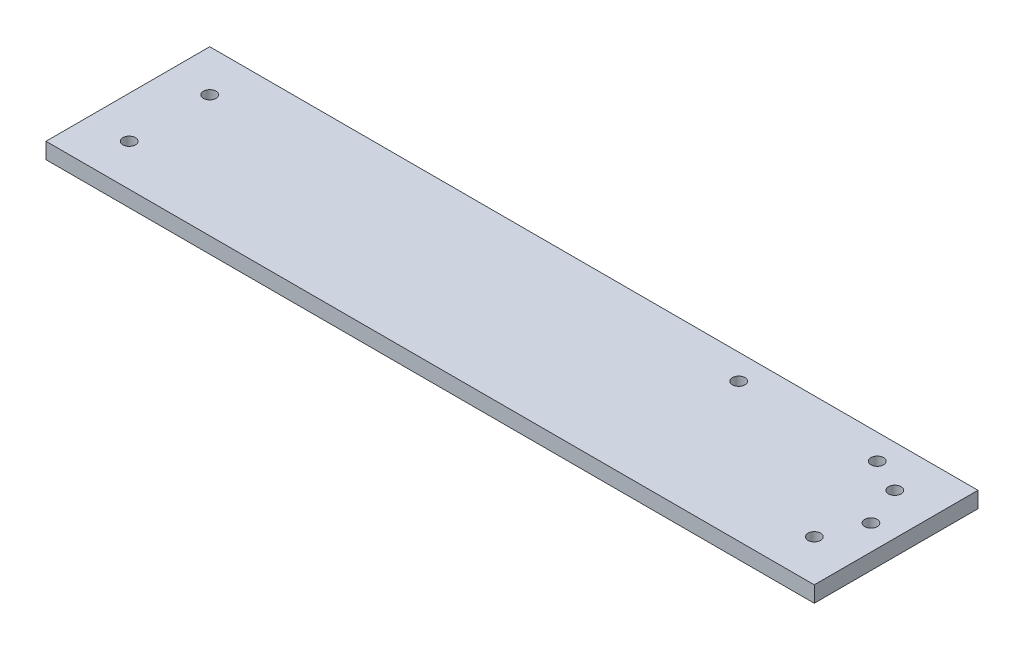
ISO-10303-21;
HEADER;
FILE_DESCRIPTION(('STEP AP214'),'2;1');
FILE_NAME('part.step','',(''),(''),'','','');
FILE_SCHEMA(('AUTOMOTIVE_DESIGN { 1 0 10303 214 1 1 1 1 }'));
ENDSEC;
DATA;
#1=APPLICATION_CONTEXT('core data for automotive mechanical design processes');
#2=APPLICATION_PROTOCOL_DEFINITION('international standard','automotive_design',2000,#1);
#3=PRODUCT_CONTEXT('',#1,'mechanical');
#4=PRODUCT('Part','Part','',(#3));
#5=PRODUCT_RELATED_PRODUCT_CATEGORY('part','',(#4));
#6=PRODUCT_DEFINITION_FORMATION('','',#4);
#7=PRODUCT_DEFINITION_CONTEXT('part definition',#1,'design');
#8=PRODUCT_DEFINITION('design','',#6,#7);
#9=PRODUCT_DEFINITION_SHAPE('','',#8);
#10=(LENGTH_UNIT() NAMED_UNIT(*) SI_UNIT(.MILLI.,.METRE.));
#11=(NAMED_UNIT(*) PLANE_ANGLE_UNIT() SI_UNIT($,.RADIAN.));
#12=(NAMED_UNIT(*) SI_UNIT($,.STERADIAN.) SOLID_ANGLE_UNIT());
#13=UNCERTAINTY_MEASURE_WITH_UNIT(LENGTH_MEASURE(1.E-05),#10,'distance_accuracy_value','');
#14=(GEOMETRIC_REPRESENTATION_CONTEXT(3) GLOBAL_UNCERTAINTY_ASSIGNED_CONTEXT((#13)) GLOBAL_UNIT_ASSIGNED_CONTEXT((#10,
#11,#12)) REPRESENTATION_CONTEXT('',''));
#15=CARTESIAN_POINT('',(0.,0.,0.));
#16=DIRECTION('',(0.,0.,1.));
#17=DIRECTION('',(1.,0.,0.));
#18=AXIS2_PLACEMENT_3D('',#15,#16,#17);
#19=CARTESIAN_POINT('',(152.5,3.175,32.5));
#20=DIRECTION('',(-1.,0.,0.));
#21=DIRECTION('',(0.,0.,1.));
#22=AXIS2_PLACEMENT_3D('',#19,#20,#21);
#23=PLANE('',#22);
#24=DIRECTION('',(0.,0.,-1.));
#25=VECTOR('',#24,1.);
#26=CARTESIAN_POINT('',(152.5,-3.175,32.5));
#27=LINE('',#26,#25);
#28=CARTESIAN_POINT('',(152.5,-3.175,32.5));
#29=VERTEX_POINT('',#28);
#30=CARTESIAN_POINT('',(152.5,-3.175,-32.5));
#31=VERTEX_POINT('',#30);
#32=EDGE_CURVE('E101',#29,#31,#27,.T.);
#33=ORIENTED_EDGE('',*,*,#32,.T.);
#34=DIRECTION('',(0.,-1.,0.));
#35=VECTOR('',#34,1.);
#36=CARTESIAN_POINT('',(152.5,3.175,-32.5));
#37=LINE('',#36,#35);
#38=CARTESIAN_POINT('',(152.5,3.175,-32.5));
#39=VERTEX_POINT('',#38);
#40=EDGE_CURVE('E11',#39,#31,#37,.T.);
#41=ORIENTED_EDGE('',*,*,#40,.F.);
#42=DIRECTION('',(0.,0.,-1.));
#43=VECTOR('',#42,1.);
#44=CARTESIAN_POINT('',(152.5,3.175,32.5));
#45=LINE('',#44,#43);
#46=CARTESIAN_POINT('',(152.5,3.175,32.5));
#47=VERTEX_POINT('',#46);
#48=EDGE_CURVE('E89',#47,#39,#45,.T.);
#49=ORIENTED_EDGE('',*,*,#48,.F.);
#50=DIRECTION('',(0.,-1.,0.));
#51=VECTOR('',#50,1.);
#52=CARTESIAN_POINT('',(152.5,3.175,32.5));
#53=LINE('',#52,#51);
#54=EDGE_CURVE('E97',#47,#29,#53,.T.);
#55=ORIENTED_EDGE('',*,*,#54,.T.);
#56=EDGE_LOOP('',(#33,#41,#49,#55));
#57=FACE_BOUND('',#56,.T.);
#58=ADVANCED_FACE('F38',(#57),#23,.F.);
#59=CARTESIAN_POINT('',(-152.5,3.175,-32.5));
#60=DIRECTION('',(0.,0.,1.));
#61=DIRECTION('',(1.,0.,0.));
#62=AXIS2_PLACEMENT_3D('',#59,#60,#61);
#63=PLANE('',#62);
#64=DIRECTION('',(-1.,0.,0.));
#65=VECTOR('',#64,1.);
#66=CARTESIAN_POINT('',(-152.5,-3.175,-32.5));
#67=LINE('',#66,#65);
#68=CARTESIAN_POINT('',(-152.5,-3.175,-32.5));
#69=VERTEX_POINT('',#68);
#70=EDGE_CURVE('E93',#31,#69,#67,.T.);
#71=ORIENTED_EDGE('',*,*,#70,.T.);
#72=DIRECTION('',(0.,-1.,0.));
#73=VECTOR('',#72,1.);
#74=CARTESIAN_POINT('',(-152.5,3.175,-32.5));
#75=LINE('',#74,#73);
#76=CARTESIAN_POINT('',(-152.5,3.175,-32.5));
#77=VERTEX_POINT('',#76);
#78=EDGE_CURVE('E46',#77,#69,#75,.T.);
#79=ORIENTED_EDGE('',*,*,#78,.F.);
#80=DIRECTION('',(-1.,0.,0.));
#81=VECTOR('',#80,1.);
#82=CARTESIAN_POINT('',(-152.5,3.175,-32.5));
#83=LINE('',#82,#81);
#84=EDGE_CURVE('E84',#39,#77,#83,.T.);
#85=ORIENTED_EDGE('',*,*,#84,.F.);
#86=ORIENTED_EDGE('',*,*,#40,.T.);
#87=EDGE_LOOP('',(#71,#79,#85,#86));
#88=FACE_BOUND('',#87,.T.);
#89=ADVANCED_FACE('F92',(#88),#63,.F.);
#90=CARTESIAN_POINT('',(-152.5,3.175,32.5));
#91=DIRECTION('',(1.,0.,0.));
#92=DIRECTION('',(0.,0.,-1.));
#93=AXIS2_PLACEMENT_3D('',#90,#91,#92);
#94=PLANE('',#93);
#95=DIRECTION('',(0.,0.,1.));
#96=VECTOR('',#95,1.);
#97=CARTESIAN_POINT('',(-152.5,-3.175,32.5));
#98=LINE('',#97,#96);
#99=CARTESIAN_POINT('',(-152.5,-3.175,32.5));
#100=VERTEX_POINT('',#99);
#101=EDGE_CURVE('E71',#69,#100,#98,.T.);
#102=ORIENTED_EDGE('',*,*,#101,.T.);
#103=DIRECTION('',(0.,-1.,0.));
#104=VECTOR('',#103,1.);
#105=CARTESIAN_POINT('',(-152.5,3.175,32.5));
#106=LINE('',#105,#104);
#107=CARTESIAN_POINT('',(-152.5,3.175,32.5));
#108=VERTEX_POINT('',#107);
#109=EDGE_CURVE('E94',#108,#100,#106,.T.);
#110=ORIENTED_EDGE('',*,*,#109,.F.);
#111=DIRECTION('',(0.,0.,1.));
#112=VECTOR('',#111,1.);
#113=CARTESIAN_POINT('',(-152.5,3.175,32.5));
#114=LINE('',#113,#112);
#115=EDGE_CURVE('E87',#77,#108,#114,.T.);
#116=ORIENTED_EDGE('',*,*,#115,.F.);
#117=ORIENTED_EDGE('',*,*,#78,.T.);
#118=EDGE_LOOP('',(#102,#110,#116,#117));
#119=FACE_BOUND('',#118,.T.);
#120=ADVANCED_FACE('F95',(#119),#94,.F.);
#121=CARTESIAN_POINT('',(-152.5,3.175,32.5));
#122=DIRECTION('',(0.,0.,-1.));
#123=DIRECTION('',(-1.,0.,0.));
#124=AXIS2_PLACEMENT_3D('',#121,#122,#123);
#125=PLANE('',#124);
#126=DIRECTION('',(1.,0.,0.));
#127=VECTOR('',#126,1.);
#128=CARTESIAN_POINT('',(-152.5,-3.175,32.5));
#129=LINE('',#128,#127);
#130=EDGE_CURVE('E77',#100,#29,#129,.T.);
#131=ORIENTED_EDGE('',*,*,#130,.T.);
#132=ORIENTED_EDGE('',*,*,#54,.F.);
#133=DIRECTION('',(1.,0.,0.));
#134=VECTOR('',#133,1.);
#135=CARTESIAN_POINT('',(-152.5,3.175,32.5));
#136=LINE('',#135,#134);
#137=EDGE_CURVE('E54',#108,#47,#136,.T.);
#138=ORIENTED_EDGE('',*,*,#137,.F.);
#139=ORIENTED_EDGE('',*,*,#109,.T.);
#140=EDGE_LOOP('',(#131,#132,#138,#139));
#141=FACE_BOUND('',#140,.T.);
#142=ADVANCED_FACE('F109',(#141),#125,.F.);
#143=CARTESIAN_POINT('',(0.,3.175,0.));
#144=DIRECTION('',(0.,-1.,0.));
#145=DIRECTION('',(0.,0.,-1.));
#146=AXIS2_PLACEMENT_3D('',#143,#144,#145);
#147=PLANE('',#146);
#148=CARTESIAN_POINT('',(142.5,3.175,0.));
#149=DIRECTION('',(0.,-1.,0.));
#150=DIRECTION('',(0.,0.,-1.));
#151=AXIS2_PLACEMENT_3D('',#148,#149,#150);
#152=CIRCLE('',#151,2.5);
#153=CARTESIAN_POINT('',(142.5,3.175,-2.5));
#154=VERTEX_POINT('',#153);
#155=EDGE_CURVE('E134',#154,#154,#152,.T.);
#156=ORIENTED_EDGE('',*,*,#155,.T.);
#157=EDGE_LOOP('',(#156));
#158=FACE_BOUND('',#157,.T.);
#159=CARTESIAN_POINT('',(67.5,3.175,-22.5));
#160=DIRECTION('',(0.,-1.,0.));
#161=DIRECTION('',(0.,0.,-1.));
#162=AXIS2_PLACEMENT_3D('',#159,#160,#161);
#163=CIRCLE('',#162,2.5);
#164=CARTESIAN_POINT('',(67.5,3.175,-25.));
#165=VERTEX_POINT('',#164);
#166=EDGE_CURVE('E141',#165,#165,#163,.T.);
#167=ORIENTED_EDGE('',*,*,#166,.T.);
#168=EDGE_LOOP('',(#167));
#169=FACE_BOUND('',#168,.T.);
#170=CARTESIAN_POINT('',(122.5,3.175,-22.5));
#171=DIRECTION('',(0.,-1.,0.));
#172=DIRECTION('',(0.,0.,-1.));
#173=AXIS2_PLACEMENT_3D('',#170,#171,#172);
#174=CIRCLE('',#173,2.49999999999999);
#175=CARTESIAN_POINT('',(122.5,3.175,-25.));
#176=VERTEX_POINT('',#175);
#177=EDGE_CURVE('E144',#176,#176,#174,.T.);
#178=ORIENTED_EDGE('',*,*,#177,.T.);
#179=EDGE_LOOP('',(#178));
#180=FACE_BOUND('',#179,.T.);
#181=CARTESIAN_POINT('',(135.98,3.175,15.98));
#182=DIRECTION('',(0.,1.,0.));
#183=DIRECTION('',(0.,0.,-1.));
#184=AXIS2_PLACEMENT_3D('',#181,#182,#183);
#185=CIRCLE('',#184,2.49999999999994);
#186=CARTESIAN_POINT('',(135.98,3.175,13.4800000000001));
#187=VERTEX_POINT('',#186);
#188=EDGE_CURVE('E122',#187,#187,#185,.T.);
#189=ORIENTED_EDGE('',*,*,#188,.F.);
#190=EDGE_LOOP('',(#189));
#191=FACE_BOUND('',#190,.T.);
#192=CARTESIAN_POINT('',(135.98,3.175,-15.98));
#193=DIRECTION('',(0.,1.,0.));
#194=DIRECTION('',(0.,0.,1.));
#195=AXIS2_PLACEMENT_3D('',#192,#193,#194);
#196=CIRCLE('',#195,2.49999999999994);
#197=CARTESIAN_POINT('',(135.98,3.175,-13.4800000000001));
#198=VERTEX_POINT('',#197);
#199=EDGE_CURVE('E127',#198,#198,#196,.T.);
#200=ORIENTED_EDGE('',*,*,#199,.F.);
#201=EDGE_LOOP('',(#200));
#202=FACE_BOUND('',#201,.T.);
#203=CARTESIAN_POINT('',(-135.98,3.175,15.98));
#204=DIRECTION('',(0.,-1.,0.));
#205=DIRECTION('',(0.,0.,-1.));
#206=AXIS2_PLACEMENT_3D('',#203,#204,#205);
#207=CIRCLE('',#206,2.49999999999994);
#208=CARTESIAN_POINT('',(-135.98,3.175,13.4800000000001));
#209=VERTEX_POINT('',#208);
#210=EDGE_CURVE('E104',#209,#209,#207,.T.);
#211=ORIENTED_EDGE('',*,*,#210,.T.);
#212=EDGE_LOOP('',(#211));
#213=FACE_BOUND('',#212,.T.);
#214=CARTESIAN_POINT('',(-135.98,3.175,-15.98));
#215=DIRECTION('',(0.,-1.,0.));
#216=DIRECTION('',(0.,0.,1.));
#217=AXIS2_PLACEMENT_3D('',#214,#215,#216);
#218=CIRCLE('',#217,2.49999999999994);
#219=CARTESIAN_POINT('',(-135.98,3.175,-13.4800000000001));
#220=VERTEX_POINT('',#219);
#221=EDGE_CURVE('E115',#220,#220,#218,.T.);
#222=ORIENTED_EDGE('',*,*,#221,.T.);
#223=EDGE_LOOP('',(#222));
#224=FACE_BOUND('',#223,.T.);
#225=ORIENTED_EDGE('',*,*,#48,.T.);
#226=ORIENTED_EDGE('',*,*,#84,.T.);
#227=ORIENTED_EDGE('',*,*,#115,.T.);
#228=ORIENTED_EDGE('',*,*,#137,.T.);
#229=EDGE_LOOP('',(#225,#226,#227,#228));
#230=FACE_BOUND('',#229,.T.);
#231=ADVANCED_FACE('F85',(#158,#169,#180,#191,#202,#213,#224,#230),#147,.F.);
#232=CARTESIAN_POINT('',(0.,-3.175,0.));
#233=DIRECTION('',(0.,-1.,0.));
#234=DIRECTION('',(0.,0.,-1.));
#235=AXIS2_PLACEMENT_3D('',#232,#233,#234);
#236=PLANE('',#235);
#237=CARTESIAN_POINT('',(142.5,-3.175,0.));
#238=DIRECTION('',(0.,1.,0.));
#239=DIRECTION('',(0.,0.,1.));
#240=AXIS2_PLACEMENT_3D('',#237,#238,#239);
#241=CIRCLE('',#240,2.5);
#242=CARTESIAN_POINT('',(142.5,-3.175,2.5));
#243=VERTEX_POINT('',#242);
#244=EDGE_CURVE('E151',#243,#243,#241,.T.);
#245=ORIENTED_EDGE('',*,*,#244,.T.);
#246=EDGE_LOOP('',(#245));
#247=FACE_BOUND('',#246,.T.);
#248=CARTESIAN_POINT('',(67.5,-3.175,-22.5));
#249=DIRECTION('',(0.,1.,0.));
#250=DIRECTION('',(0.,0.,1.));
#251=AXIS2_PLACEMENT_3D('',#248,#249,#250);
#252=CIRCLE('',#251,2.5);
#253=CARTESIAN_POINT('',(67.5,-3.175,-20.));
#254=VERTEX_POINT('',#253);
#255=EDGE_CURVE('E150',#254,#254,#252,.T.);
#256=ORIENTED_EDGE('',*,*,#255,.T.);
#257=EDGE_LOOP('',(#256));
#258=FACE_BOUND('',#257,.T.);
#259=CARTESIAN_POINT('',(122.5,-3.175,-22.5));
#260=DIRECTION('',(0.,1.,0.));
#261=DIRECTION('',(0.,0.,1.));
#262=AXIS2_PLACEMENT_3D('',#259,#260,#261);
#263=CIRCLE('',#262,2.49999999999999);
#264=CARTESIAN_POINT('',(122.5,-3.175,-20.));
#265=VERTEX_POINT('',#264);
#266=EDGE_CURVE('E147',#265,#265,#263,.T.);
#267=ORIENTED_EDGE('',*,*,#266,.T.);
#268=EDGE_LOOP('',(#267));
#269=FACE_BOUND('',#268,.T.);
#270=CARTESIAN_POINT('',(135.98,-3.175,15.98));
#271=DIRECTION('',(0.,1.,0.));
#272=DIRECTION('',(0.,0.,-1.));
#273=AXIS2_PLACEMENT_3D('',#270,#271,#272);
#274=CIRCLE('',#273,2.49999999999994);
#275=CARTESIAN_POINT('',(135.98,-3.175,13.4800000000001));
#276=VERTEX_POINT('',#275);
#277=EDGE_CURVE('E130',#276,#276,#274,.T.);
#278=ORIENTED_EDGE('',*,*,#277,.T.);
#279=EDGE_LOOP('',(#278));
#280=FACE_BOUND('',#279,.T.);
#281=CARTESIAN_POINT('',(135.98,-3.175,-15.98));
#282=DIRECTION('',(0.,1.,0.));
#283=DIRECTION('',(0.,0.,1.));
#284=AXIS2_PLACEMENT_3D('',#281,#282,#283);
#285=CIRCLE('',#284,2.49999999999994);
#286=CARTESIAN_POINT('',(135.98,-3.175,-13.4800000000001));
#287=VERTEX_POINT('',#286);
#288=EDGE_CURVE('E131',#287,#287,#285,.T.);
#289=ORIENTED_EDGE('',*,*,#288,.T.);
#290=EDGE_LOOP('',(#289));
#291=FACE_BOUND('',#290,.T.);
#292=CARTESIAN_POINT('',(-135.98,-3.175,15.98));
#293=DIRECTION('',(0.,-1.,0.));
#294=DIRECTION('',(0.,0.,-1.));
#295=AXIS2_PLACEMENT_3D('',#292,#293,#294);
#296=CIRCLE('',#295,2.49999999999994);
#297=CARTESIAN_POINT('',(-135.98,-3.175,13.4800000000001));
#298=VERTEX_POINT('',#297);
#299=EDGE_CURVE('E118',#298,#298,#296,.T.);
#300=ORIENTED_EDGE('',*,*,#299,.F.);
#301=EDGE_LOOP('',(#300));
#302=FACE_BOUND('',#301,.T.);
#303=CARTESIAN_POINT('',(-135.98,-3.175,-15.98));
#304=DIRECTION('',(0.,-1.,0.));
#305=DIRECTION('',(0.,0.,1.));
#306=AXIS2_PLACEMENT_3D('',#303,#304,#305);
#307=CIRCLE('',#306,2.49999999999994);
#308=CARTESIAN_POINT('',(-135.98,-3.175,-13.4800000000001));
#309=VERTEX_POINT('',#308);
#310=EDGE_CURVE('E119',#309,#309,#307,.T.);
#311=ORIENTED_EDGE('',*,*,#310,.F.);
#312=EDGE_LOOP('',(#311));
#313=FACE_BOUND('',#312,.T.);
#314=ORIENTED_EDGE('',*,*,#32,.F.);
#315=ORIENTED_EDGE('',*,*,#130,.F.);
#316=ORIENTED_EDGE('',*,*,#101,.F.);
#317=ORIENTED_EDGE('',*,*,#70,.F.);
#318=EDGE_LOOP('',(#314,#315,#316,#317));
#319=FACE_BOUND('',#318,.T.);
#320=ADVANCED_FACE('F112',(#247,#258,#269,#280,#291,#302,#313,#319),#236,.T.);
#321=CARTESIAN_POINT('',(-135.98,3.175,-15.98));
#322=DIRECTION('',(0.,-1.,0.));
#323=DIRECTION('',(0.,0.,-1.));
#324=AXIS2_PLACEMENT_3D('',#321,#322,#323);
#325=CYLINDRICAL_SURFACE('',#324,2.49999999999994);
#326=ORIENTED_EDGE('',*,*,#221,.F.);
#327=EDGE_LOOP('',(#326));
#328=FACE_BOUND('',#327,.T.);
#329=ORIENTED_EDGE('',*,*,#310,.T.);
#330=EDGE_LOOP('',(#329));
#331=FACE_BOUND('',#330,.T.);
#332=ADVANCED_FACE('F181',(#328,#331),#325,.F.);
#333=CARTESIAN_POINT('',(-135.98,3.175,15.98));
#334=DIRECTION('',(0.,-1.,0.));
#335=DIRECTION('',(0.,0.,-1.));
#336=AXIS2_PLACEMENT_3D('',#333,#334,#335);
#337=CYLINDRICAL_SURFACE('',#336,2.49999999999994);
#338=ORIENTED_EDGE('',*,*,#210,.F.);
#339=EDGE_LOOP('',(#338));
#340=FACE_BOUND('',#339,.T.);
#341=ORIENTED_EDGE('',*,*,#299,.T.);
#342=EDGE_LOOP('',(#341));
#343=FACE_BOUND('',#342,.T.);
#344=ADVANCED_FACE('F184',(#340,#343),#337,.F.);
#345=CARTESIAN_POINT('',(135.98,3.175,-15.98));
#346=DIRECTION('',(0.,-1.,0.));
#347=DIRECTION('',(0.,0.,-1.));
#348=AXIS2_PLACEMENT_3D('',#345,#346,#347);
#349=CYLINDRICAL_SURFACE('',#348,2.49999999999994);
#350=ORIENTED_EDGE('',*,*,#199,.T.);
#351=EDGE_LOOP('',(#350));
#352=FACE_BOUND('',#351,.T.);
#353=ORIENTED_EDGE('',*,*,#288,.F.);
#354=EDGE_LOOP('',(#353));
#355=FACE_BOUND('',#354,.T.);
#356=ADVANCED_FACE('F230',(#352,#355),#349,.F.);
#357=CARTESIAN_POINT('',(135.98,3.175,15.98));
#358=DIRECTION('',(0.,-1.,0.));
#359=DIRECTION('',(0.,0.,-1.));
#360=AXIS2_PLACEMENT_3D('',#357,#358,#359);
#361=CYLINDRICAL_SURFACE('',#360,2.49999999999994);
#362=ORIENTED_EDGE('',*,*,#188,.T.);
#363=EDGE_LOOP('',(#362));
#364=FACE_BOUND('',#363,.T.);
#365=ORIENTED_EDGE('',*,*,#277,.F.);
#366=EDGE_LOOP('',(#365));
#367=FACE_BOUND('',#366,.T.);
#368=ADVANCED_FACE('F241',(#364,#367),#361,.F.);
#369=CARTESIAN_POINT('',(122.5,-3.175,-22.5));
#370=DIRECTION('',(0.,1.,0.));
#371=DIRECTION('',(0.,0.,1.));
#372=AXIS2_PLACEMENT_3D('',#369,#370,#371);
#373=CYLINDRICAL_SURFACE('',#372,2.49999999999999);
#374=ORIENTED_EDGE('',*,*,#266,.F.);
#375=EDGE_LOOP('',(#374));
#376=FACE_BOUND('',#375,.T.);
#377=ORIENTED_EDGE('',*,*,#177,.F.);
#378=EDGE_LOOP('',(#377));
#379=FACE_BOUND('',#378,.T.);
#380=ADVANCED_FACE('F163',(#376,#379),#373,.F.);
#381=CARTESIAN_POINT('',(67.5,-3.175,-22.5));
#382=DIRECTION('',(0.,1.,0.));
#383=DIRECTION('',(0.,0.,1.));
#384=AXIS2_PLACEMENT_3D('',#381,#382,#383);
#385=CYLINDRICAL_SURFACE('',#384,2.5);
#386=ORIENTED_EDGE('',*,*,#255,.F.);
#387=EDGE_LOOP('',(#386));
#388=FACE_BOUND('',#387,.T.);
#389=ORIENTED_EDGE('',*,*,#166,.F.);
#390=EDGE_LOOP('',(#389));
#391=FACE_BOUND('',#390,.T.);
#392=ADVANCED_FACE('F159',(#388,#391),#385,.F.);
#393=CARTESIAN_POINT('',(142.5,-3.175,0.));
#394=DIRECTION('',(0.,1.,0.));
#395=DIRECTION('',(0.,0.,1.));
#396=AXIS2_PLACEMENT_3D('',#393,#394,#395);
#397=CYLINDRICAL_SURFACE('',#396,2.5);
#398=ORIENTED_EDGE('',*,*,#244,.F.);
#399=EDGE_LOOP('',(#398));
#400=FACE_BOUND('',#399,.T.);
#401=ORIENTED_EDGE('',*,*,#155,.F.);
#402=EDGE_LOOP('',(#401));
#403=FACE_BOUND('',#402,.T.);
#404=ADVANCED_FACE('F162',(#400,#403),#397,.F.);
#405=CLOSED_SHELL('',(#58,#89,#120,#142,#231,#320,#332,#344,#356,#368,#380,#392,#404));
#406=MANIFOLD_SOLID_BREP('B2',#405);
#407=ADVANCED_BREP_SHAPE_REPRESENTATION('',(#18,#406),#14);
#408=SHAPE_DEFINITION_REPRESENTATION(#9,#407);
ENDSEC;
END-ISO-10303-21;
